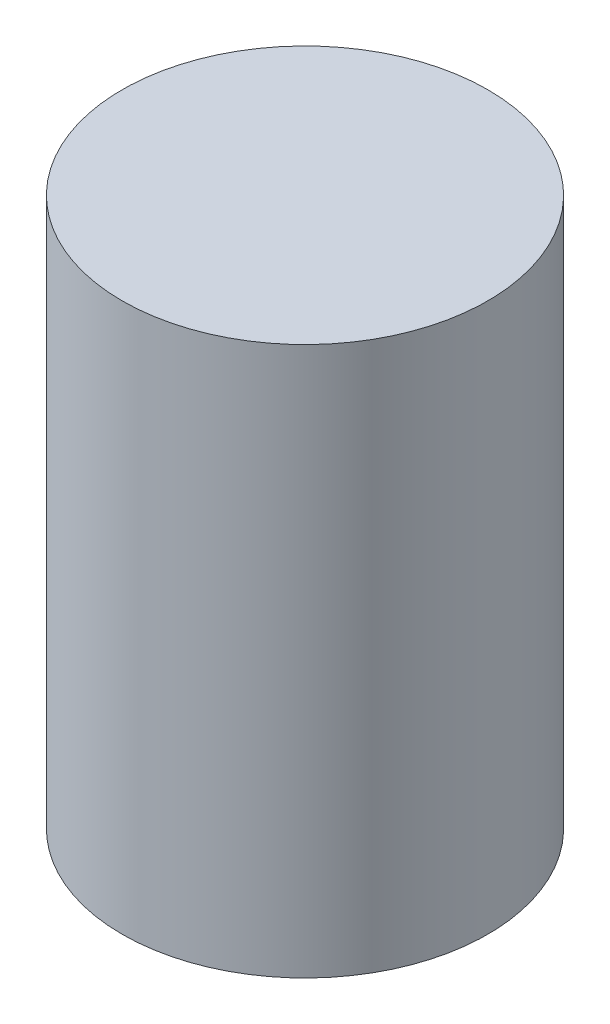
ISO-10303-21;
HEADER;
FILE_DESCRIPTION(('STEP AP214'),'2;1');
FILE_NAME('part.step','',(''),(''),'','','');
FILE_SCHEMA(('AUTOMOTIVE_DESIGN { 1 0 10303 214 1 1 1 1 }'));
ENDSEC;
DATA;
#1=APPLICATION_CONTEXT('core data for automotive mechanical design processes');
#2=APPLICATION_PROTOCOL_DEFINITION('international standard','automotive_design',2000,#1);
#3=PRODUCT_CONTEXT('',#1,'mechanical');
#4=PRODUCT('Part','Part','',(#3));
#5=PRODUCT_RELATED_PRODUCT_CATEGORY('part','',(#4));
#6=PRODUCT_DEFINITION_FORMATION('','',#4);
#7=PRODUCT_DEFINITION_CONTEXT('part definition',#1,'design');
#8=PRODUCT_DEFINITION('design','',#6,#7);
#9=PRODUCT_DEFINITION_SHAPE('','',#8);
#10=(LENGTH_UNIT() NAMED_UNIT(*) SI_UNIT(.MILLI.,.METRE.));
#11=(NAMED_UNIT(*) PLANE_ANGLE_UNIT() SI_UNIT($,.RADIAN.));
#12=(NAMED_UNIT(*) SI_UNIT($,.STERADIAN.) SOLID_ANGLE_UNIT());
#13=UNCERTAINTY_MEASURE_WITH_UNIT(LENGTH_MEASURE(1.E-05),#10,'distance_accuracy_value','');
#14=(GEOMETRIC_REPRESENTATION_CONTEXT(3) GLOBAL_UNCERTAINTY_ASSIGNED_CONTEXT((#13)) GLOBAL_UNIT_ASSIGNED_CONTEXT((#10,
#11,#12)) REPRESENTATION_CONTEXT('',''));
#15=CARTESIAN_POINT('',(0.,0.,0.));
#16=DIRECTION('',(0.,0.,1.));
#17=DIRECTION('',(1.,0.,0.));
#18=AXIS2_PLACEMENT_3D('',#15,#16,#17);
#19=CARTESIAN_POINT('',(0.,38.1,0.));
#20=DIRECTION('',(0.,-1.,0.));
#21=DIRECTION('',(0.,0.,-1.));
#22=AXIS2_PLACEMENT_3D('',#19,#20,#21);
#23=CYLINDRICAL_SURFACE('',#22,12.7);
#24=CARTESIAN_POINT('',(0.,38.1,0.));
#25=DIRECTION('',(0.,1.,0.));
#26=DIRECTION('',(0.,0.,1.));
#27=AXIS2_PLACEMENT_3D('',#24,#25,#26);
#28=CIRCLE('',#27,12.7);
#29=CARTESIAN_POINT('',(0.,38.1,-12.7));
#30=VERTEX_POINT('',#29);
#31=EDGE_CURVE('E10',#30,#30,#28,.T.);
#32=CARTESIAN_POINT('',(0.,0.,0.));
#33=DIRECTION('',(0.,1.,0.));
#34=DIRECTION('',(0.,0.,1.));
#35=AXIS2_PLACEMENT_3D('',#32,#33,#34);
#36=CIRCLE('',#35,12.7);
#37=CARTESIAN_POINT('',(0.,0.,-12.7));
#38=VERTEX_POINT('',#37);
#39=EDGE_CURVE('E44',#38,#38,#36,.T.);
#40=CARTESIAN_POINT('',(0.,38.1,-12.7));
#41=CARTESIAN_POINT('',(0.,37.703125,-12.7));
#42=CARTESIAN_POINT('',(0.,37.30625,-12.7));
#43=CARTESIAN_POINT('',(0.,36.5125,-12.7));
#44=CARTESIAN_POINT('',(0.,36.115625,-12.7));
#45=CARTESIAN_POINT('',(0.,35.321875,-12.7));
#46=CARTESIAN_POINT('',(0.,34.925,-12.7));
#47=CARTESIAN_POINT('',(0.,34.13125,-12.7));
#48=CARTESIAN_POINT('',(0.,33.734375,-12.7));
#49=CARTESIAN_POINT('',(0.,32.940625,-12.7));
#50=CARTESIAN_POINT('',(0.,32.54375,-12.7));
#51=CARTESIAN_POINT('',(0.,31.75,-12.7));
#52=CARTESIAN_POINT('',(0.,31.353125,-12.7));
#53=CARTESIAN_POINT('',(0.,30.559375,-12.7));
#54=CARTESIAN_POINT('',(0.,30.1625,-12.7));
#55=CARTESIAN_POINT('',(0.,29.36875,-12.7));
#56=CARTESIAN_POINT('',(0.,28.971875,-12.7));
#57=CARTESIAN_POINT('',(0.,28.178125,-12.7));
#58=CARTESIAN_POINT('',(0.,27.78125,-12.7));
#59=CARTESIAN_POINT('',(0.,26.9875,-12.7));
#60=CARTESIAN_POINT('',(0.,26.590625,-12.7));
#61=CARTESIAN_POINT('',(0.,25.796875,-12.7));
#62=CARTESIAN_POINT('',(0.,25.4,-12.7));
#63=CARTESIAN_POINT('',(0.,24.60625,-12.7));
#64=CARTESIAN_POINT('',(0.,24.209375,-12.7));
#65=CARTESIAN_POINT('',(0.,23.415625,-12.7));
#66=CARTESIAN_POINT('',(0.,23.01875,-12.7));
#67=CARTESIAN_POINT('',(0.,22.225,-12.7));
#68=CARTESIAN_POINT('',(0.,21.828125,-12.7));
#69=CARTESIAN_POINT('',(0.,21.034375,-12.7));
#70=CARTESIAN_POINT('',(0.,20.6375,-12.7));
#71=CARTESIAN_POINT('',(0.,19.84375,-12.7));
#72=CARTESIAN_POINT('',(0.,19.446875,-12.7));
#73=CARTESIAN_POINT('',(0.,18.653125,-12.7));
#74=CARTESIAN_POINT('',(0.,18.25625,-12.7));
#75=CARTESIAN_POINT('',(0.,17.4625,-12.7));
#76=CARTESIAN_POINT('',(0.,17.065625,-12.7));
#77=CARTESIAN_POINT('',(0.,16.271875,-12.7));
#78=CARTESIAN_POINT('',(0.,15.875,-12.7));
#79=CARTESIAN_POINT('',(0.,15.08125,-12.7));
#80=CARTESIAN_POINT('',(0.,14.684375,-12.7));
#81=CARTESIAN_POINT('',(0.,13.890625,-12.7));
#82=CARTESIAN_POINT('',(0.,13.49375,-12.7));
#83=CARTESIAN_POINT('',(0.,12.7,-12.7));
#84=CARTESIAN_POINT('',(0.,12.303125,-12.7));
#85=CARTESIAN_POINT('',(0.,11.509375,-12.7));
#86=CARTESIAN_POINT('',(0.,11.1125,-12.7));
#87=CARTESIAN_POINT('',(0.,10.31875,-12.7));
#88=CARTESIAN_POINT('',(0.,9.92187499999999,-12.7));
#89=CARTESIAN_POINT('',(0.,9.128125,-12.7));
#90=CARTESIAN_POINT('',(0.,8.73124999999999,-12.7));
#91=CARTESIAN_POINT('',(0.,7.93749999999999,-12.7));
#92=CARTESIAN_POINT('',(0.,7.54062499999999,-12.7));
#93=CARTESIAN_POINT('',(0.,6.746875,-12.7));
#94=CARTESIAN_POINT('',(0.,6.35,-12.7));
#95=CARTESIAN_POINT('',(0.,5.55625,-12.7));
#96=CARTESIAN_POINT('',(0.,5.159375,-12.7));
#97=CARTESIAN_POINT('',(0.,4.365625,-12.7));
#98=CARTESIAN_POINT('',(0.,3.96875,-12.7));
#99=CARTESIAN_POINT('',(0.,3.175,-12.7));
#100=CARTESIAN_POINT('',(0.,2.778125,-12.7));
#101=CARTESIAN_POINT('',(0.,1.984375,-12.7));
#102=CARTESIAN_POINT('',(0.,1.5875,-12.7));
#103=CARTESIAN_POINT('',(0.,0.79375,-12.7));
#104=CARTESIAN_POINT('',(0.,0.396875,-12.7));
#105=CARTESIAN_POINT('',(0.,0.,-12.7));
#106=B_SPLINE_CURVE_WITH_KNOTS('',3,(#40,#41,#42,#43,#44,#45,#46,#47,#48,#49,#50,#51,#52,#53,
#54,#55,#56,#57,#58,#59,#60,#61,#62,#63,#64,#65,#66,#67,#68,#69,#70,#71,#72,#73,#74,#75,#76,#77,
#78,#79,#80,#81,#82,#83,#84,#85,#86,#87,#88,#89,#90,#91,#92,#93,#94,#95,#96,#97,#98,#99,#100,
#101,#102,#103,#104,#105),.UNSPECIFIED.,.F.,.F.,(4,2,2,2,2,2,2,2,2,2,2,2,2,2,2,2,2,2,2,2,2,2,2,
2,2,2,2,2,2,2,2,2,4),(0.,1.190625,2.38125,3.571875,4.7625,5.953125,7.14375,8.334375,
9.52500000000001,10.715625,11.90625,13.096875,14.2875,15.478125,16.66875,17.859375,19.05,
20.240625,21.43125,22.621875,23.8125,25.003125,26.19375,27.384375,28.575,29.765625,30.95625,
32.146875,33.3375,34.528125,35.71875,36.909375,38.1),.UNSPECIFIED.);
#107=EDGE_CURVE('BSEAM41',#30,#38,#106,.T.);
#108=ORIENTED_EDGE('',*,*,#31,.F.);
#109=ORIENTED_EDGE('',*,*,#39,.T.);
#110=ORIENTED_EDGE('',*,*,#107,.T.);
#111=ORIENTED_EDGE('',*,*,#107,.F.);
#112=EDGE_LOOP('',(#108,#110,#109,#111));
#113=FACE_BOUND('',#112,.T.);
#114=ADVANCED_FACE('F41',(#113),#23,.T.);
#115=CARTESIAN_POINT('',(0.,38.1,0.));
#116=DIRECTION('',(0.,1.,0.));
#117=DIRECTION('',(0.,0.,1.));
#118=AXIS2_PLACEMENT_3D('',#115,#116,#117);
#119=PLANE('',#118);
#120=ORIENTED_EDGE('',*,*,#31,.T.);
#121=EDGE_LOOP('',(#120));
#122=FACE_BOUND('',#121,.T.);
#123=ADVANCED_FACE('F58',(#122),#119,.T.);
#124=CARTESIAN_POINT('',(0.,0.,0.));
#125=DIRECTION('',(0.,1.,0.));
#126=DIRECTION('',(0.,0.,1.));
#127=AXIS2_PLACEMENT_3D('',#124,#125,#126);
#128=PLANE('',#127);
#129=ORIENTED_EDGE('',*,*,#39,.F.);
#130=EDGE_LOOP('',(#129));
#131=FACE_BOUND('',#130,.T.);
#132=ADVANCED_FACE('F56',(#131),#128,.F.);
#133=CLOSED_SHELL('',(#114,#123,#132));
#134=MANIFOLD_SOLID_BREP('B2',#133);
#135=ADVANCED_BREP_SHAPE_REPRESENTATION('',(#18,#134),#14);
#136=SHAPE_DEFINITION_REPRESENTATION(#9,#135);
ENDSEC;
END-ISO-10303-21;
